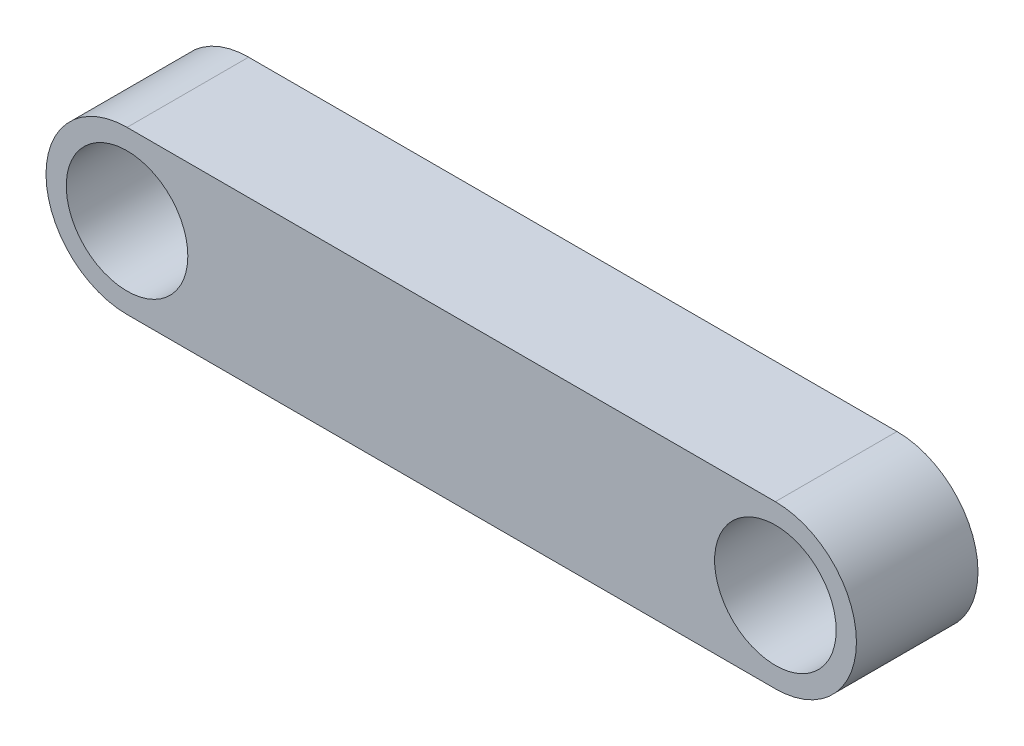
ISO-10303-21;
HEADER;
FILE_DESCRIPTION(('STEP AP214'),'2;1');
FILE_NAME('part.step','',(''),(''),'','','');
FILE_SCHEMA(('AUTOMOTIVE_DESIGN { 1 0 10303 214 1 1 1 1 }'));
ENDSEC;
DATA;
#1=APPLICATION_CONTEXT('core data for automotive mechanical design processes');
#2=APPLICATION_PROTOCOL_DEFINITION('international standard','automotive_design',2000,#1);
#3=PRODUCT_CONTEXT('',#1,'mechanical');
#4=PRODUCT('Part','Part','',(#3));
#5=PRODUCT_RELATED_PRODUCT_CATEGORY('part','',(#4));
#6=PRODUCT_DEFINITION_FORMATION('','',#4);
#7=PRODUCT_DEFINITION_CONTEXT('part definition',#1,'design');
#8=PRODUCT_DEFINITION('design','',#6,#7);
#9=PRODUCT_DEFINITION_SHAPE('','',#8);
#10=(LENGTH_UNIT() NAMED_UNIT(*) SI_UNIT(.MILLI.,.METRE.));
#11=(NAMED_UNIT(*) PLANE_ANGLE_UNIT() SI_UNIT($,.RADIAN.));
#12=(NAMED_UNIT(*) SI_UNIT($,.STERADIAN.) SOLID_ANGLE_UNIT());
#13=UNCERTAINTY_MEASURE_WITH_UNIT(LENGTH_MEASURE(1.E-05),#10,'distance_accuracy_value','');
#14=(GEOMETRIC_REPRESENTATION_CONTEXT(3) GLOBAL_UNCERTAINTY_ASSIGNED_CONTEXT((#13)) GLOBAL_UNIT_ASSIGNED_CONTEXT((#10,
#11,#12)) REPRESENTATION_CONTEXT('',''));
#15=CARTESIAN_POINT('',(0.,0.,0.));
#16=DIRECTION('',(0.,0.,1.));
#17=DIRECTION('',(1.,0.,0.));
#18=AXIS2_PLACEMENT_3D('',#15,#16,#17);
#19=CARTESIAN_POINT('',(8.,0.,3.));
#20=DIRECTION('',(0.,0.,-1.));
#21=DIRECTION('',(-1.,0.,0.));
#22=AXIS2_PLACEMENT_3D('',#19,#20,#21);
#23=CYLINDRICAL_SURFACE('',#22,1.5);
#24=CARTESIAN_POINT('',(8.,0.,3.));
#25=DIRECTION('',(0.,0.,1.));
#26=DIRECTION('',(1.,0.,0.));
#27=AXIS2_PLACEMENT_3D('',#24,#25,#26);
#28=CIRCLE('',#27,1.5);
#29=CARTESIAN_POINT('',(9.5,0.,3.));
#30=VERTEX_POINT('',#29);
#31=EDGE_CURVE('E140',#30,#30,#28,.F.);
#32=ORIENTED_EDGE('',*,*,#31,.F.);
#33=EDGE_LOOP('',(#32));
#34=FACE_BOUND('',#33,.T.);
#35=CARTESIAN_POINT('',(8.,0.,0.));
#36=DIRECTION('',(0.,0.,1.));
#37=DIRECTION('',(1.,0.,0.));
#38=AXIS2_PLACEMENT_3D('',#35,#36,#37);
#39=CIRCLE('',#38,1.5);
#40=CARTESIAN_POINT('',(9.5,0.,0.));
#41=VERTEX_POINT('',#40);
#42=EDGE_CURVE('E152',#41,#41,#39,.F.);
#43=ORIENTED_EDGE('',*,*,#42,.T.);
#44=EDGE_LOOP('',(#43));
#45=FACE_BOUND('',#44,.T.);
#46=ADVANCED_FACE('F77',(#34,#45),#23,.F.);
#47=CARTESIAN_POINT('',(8.,0.,3.));
#48=DIRECTION('',(0.,0.,-1.));
#49=DIRECTION('',(-1.,0.,0.));
#50=AXIS2_PLACEMENT_3D('',#47,#48,#49);
#51=CYLINDRICAL_SURFACE('',#50,2.00000000000001);
#52=CARTESIAN_POINT('',(8.,0.,0.));
#53=DIRECTION('',(0.,0.,1.));
#54=DIRECTION('',(1.,0.,0.));
#55=AXIS2_PLACEMENT_3D('',#52,#53,#54);
#56=CIRCLE('',#55,2.00000000000001);
#57=CARTESIAN_POINT('',(8.,2.,0.));
#58=VERTEX_POINT('',#57);
#59=CARTESIAN_POINT('',(8.,-2.,0.));
#60=VERTEX_POINT('',#59);
#61=EDGE_CURVE('E128',#58,#60,#56,.F.);
#62=ORIENTED_EDGE('',*,*,#61,.F.);
#63=DIRECTION('',(0.,0.,-1.));
#64=VECTOR('',#63,1.);
#65=CARTESIAN_POINT('',(8.,2.,3.));
#66=LINE('',#65,#64);
#67=CARTESIAN_POINT('',(8.,2.,3.));
#68=VERTEX_POINT('',#67);
#69=EDGE_CURVE('E87',#68,#58,#66,.T.);
#70=ORIENTED_EDGE('',*,*,#69,.F.);
#71=CARTESIAN_POINT('',(8.,0.,3.));
#72=DIRECTION('',(0.,0.,1.));
#73=DIRECTION('',(1.,0.,0.));
#74=AXIS2_PLACEMENT_3D('',#71,#72,#73);
#75=CIRCLE('',#74,2.00000000000001);
#76=CARTESIAN_POINT('',(8.,-2.,3.));
#77=VERTEX_POINT('',#76);
#78=EDGE_CURVE('E126',#68,#77,#75,.F.);
#79=ORIENTED_EDGE('',*,*,#78,.T.);
#80=DIRECTION('',(0.,0.,-1.));
#81=VECTOR('',#80,1.);
#82=CARTESIAN_POINT('',(8.,-2.,3.));
#83=LINE('',#82,#81);
#84=EDGE_CURVE('E12',#77,#60,#83,.T.);
#85=ORIENTED_EDGE('',*,*,#84,.T.);
#86=EDGE_LOOP('',(#62,#70,#79,#85));
#87=FACE_BOUND('',#86,.T.);
#88=ADVANCED_FACE('F125',(#87),#51,.T.);
#89=CARTESIAN_POINT('',(0.,2.,3.));
#90=DIRECTION('',(0.,1.,0.));
#91=DIRECTION('',(0.,0.,1.));
#92=AXIS2_PLACEMENT_3D('',#89,#90,#91);
#93=PLANE('',#92);
#94=DIRECTION('',(1.,0.,0.));
#95=VECTOR('',#94,1.);
#96=CARTESIAN_POINT('',(0.,2.,0.));
#97=LINE('',#96,#95);
#98=CARTESIAN_POINT('',(-8.,2.,0.));
#99=VERTEX_POINT('',#98);
#100=EDGE_CURVE('E150',#99,#58,#97,.T.);
#101=ORIENTED_EDGE('',*,*,#100,.F.);
#102=DIRECTION('',(0.,0.,-1.));
#103=VECTOR('',#102,1.);
#104=CARTESIAN_POINT('',(-8.,2.,3.));
#105=LINE('',#104,#103);
#106=CARTESIAN_POINT('',(-8.,2.,3.));
#107=VERTEX_POINT('',#106);
#108=EDGE_CURVE('E109',#107,#99,#105,.T.);
#109=ORIENTED_EDGE('',*,*,#108,.F.);
#110=DIRECTION('',(1.,0.,0.));
#111=VECTOR('',#110,1.);
#112=CARTESIAN_POINT('',(0.,2.,3.));
#113=LINE('',#112,#111);
#114=EDGE_CURVE('E137',#107,#68,#113,.T.);
#115=ORIENTED_EDGE('',*,*,#114,.T.);
#116=ORIENTED_EDGE('',*,*,#69,.T.);
#117=EDGE_LOOP('',(#101,#109,#115,#116));
#118=FACE_BOUND('',#117,.T.);
#119=ADVANCED_FACE('F139',(#118),#93,.T.);
#120=CARTESIAN_POINT('',(0.,-2.,3.));
#121=DIRECTION('',(0.,1.,0.));
#122=DIRECTION('',(0.,0.,1.));
#123=AXIS2_PLACEMENT_3D('',#120,#121,#122);
#124=PLANE('',#123);
#125=DIRECTION('',(1.,0.,0.));
#126=VECTOR('',#125,1.);
#127=CARTESIAN_POINT('',(0.,-2.,0.));
#128=LINE('',#127,#126);
#129=CARTESIAN_POINT('',(-8.,-2.,0.));
#130=VERTEX_POINT('',#129);
#131=EDGE_CURVE('E146',#130,#60,#128,.T.);
#132=ORIENTED_EDGE('',*,*,#131,.T.);
#133=ORIENTED_EDGE('',*,*,#84,.F.);
#134=DIRECTION('',(1.,0.,0.));
#135=VECTOR('',#134,1.);
#136=CARTESIAN_POINT('',(0.,-2.,3.));
#137=LINE('',#136,#135);
#138=CARTESIAN_POINT('',(-8.,-2.,3.));
#139=VERTEX_POINT('',#138);
#140=EDGE_CURVE('E119',#139,#77,#137,.T.);
#141=ORIENTED_EDGE('',*,*,#140,.F.);
#142=DIRECTION('',(0.,0.,-1.));
#143=VECTOR('',#142,1.);
#144=CARTESIAN_POINT('',(-8.,-2.,3.));
#145=LINE('',#144,#143);
#146=EDGE_CURVE('E96',#139,#130,#145,.T.);
#147=ORIENTED_EDGE('',*,*,#146,.T.);
#148=EDGE_LOOP('',(#132,#133,#141,#147));
#149=FACE_BOUND('',#148,.T.);
#150=ADVANCED_FACE('F166',(#149),#124,.F.);
#151=CARTESIAN_POINT('',(0.,0.,0.));
#152=DIRECTION('',(0.,0.,1.));
#153=DIRECTION('',(1.,0.,0.));
#154=AXIS2_PLACEMENT_3D('',#151,#152,#153);
#155=PLANE('',#154);
#156=ORIENTED_EDGE('',*,*,#131,.F.);
#157=CARTESIAN_POINT('',(-8.,0.,0.));
#158=DIRECTION('',(0.,0.,1.));
#159=DIRECTION('',(1.,0.,0.));
#160=AXIS2_PLACEMENT_3D('',#157,#158,#159);
#161=CIRCLE('',#160,2.);
#162=EDGE_CURVE('E81',#99,#130,#161,.T.);
#163=ORIENTED_EDGE('',*,*,#162,.F.);
#164=ORIENTED_EDGE('',*,*,#100,.T.);
#165=ORIENTED_EDGE('',*,*,#61,.T.);
#166=EDGE_LOOP('',(#156,#163,#164,#165));
#167=FACE_BOUND('',#166,.T.);
#168=ORIENTED_EDGE('',*,*,#42,.F.);
#169=EDGE_LOOP('',(#168));
#170=FACE_BOUND('',#169,.T.);
#171=CARTESIAN_POINT('',(-8.,0.,0.));
#172=DIRECTION('',(0.,0.,1.));
#173=DIRECTION('',(1.,0.,0.));
#174=AXIS2_PLACEMENT_3D('',#171,#172,#173);
#175=CIRCLE('',#174,1.5);
#176=CARTESIAN_POINT('',(-6.5,0.,0.));
#177=VERTEX_POINT('',#176);
#178=EDGE_CURVE('E160',#177,#177,#175,.T.);
#179=ORIENTED_EDGE('',*,*,#178,.T.);
#180=EDGE_LOOP('',(#179));
#181=FACE_BOUND('',#180,.T.);
#182=ADVANCED_FACE('F164',(#167,#170,#181),#155,.F.);
#183=CARTESIAN_POINT('',(0.,0.,3.));
#184=DIRECTION('',(0.,0.,1.));
#185=DIRECTION('',(1.,0.,0.));
#186=AXIS2_PLACEMENT_3D('',#183,#184,#185);
#187=PLANE('',#186);
#188=ORIENTED_EDGE('',*,*,#140,.T.);
#189=ORIENTED_EDGE('',*,*,#78,.F.);
#190=ORIENTED_EDGE('',*,*,#114,.F.);
#191=CARTESIAN_POINT('',(-8.,0.,3.));
#192=DIRECTION('',(0.,0.,1.));
#193=DIRECTION('',(1.,0.,0.));
#194=AXIS2_PLACEMENT_3D('',#191,#192,#193);
#195=CIRCLE('',#194,2.);
#196=EDGE_CURVE('E148',#107,#139,#195,.T.);
#197=ORIENTED_EDGE('',*,*,#196,.T.);
#198=EDGE_LOOP('',(#188,#189,#190,#197));
#199=FACE_BOUND('',#198,.T.);
#200=ORIENTED_EDGE('',*,*,#31,.T.);
#201=EDGE_LOOP('',(#200));
#202=FACE_BOUND('',#201,.T.);
#203=CARTESIAN_POINT('',(-8.,0.,3.));
#204=DIRECTION('',(0.,0.,1.));
#205=DIRECTION('',(1.,0.,0.));
#206=AXIS2_PLACEMENT_3D('',#203,#204,#205);
#207=CIRCLE('',#206,1.5);
#208=CARTESIAN_POINT('',(-6.5,0.,3.));
#209=VERTEX_POINT('',#208);
#210=EDGE_CURVE('E157',#209,#209,#207,.T.);
#211=ORIENTED_EDGE('',*,*,#210,.F.);
#212=EDGE_LOOP('',(#211));
#213=FACE_BOUND('',#212,.T.);
#214=ADVANCED_FACE('F135',(#199,#202,#213),#187,.T.);
#215=CARTESIAN_POINT('',(-8.,0.,3.));
#216=DIRECTION('',(0.,0.,-1.));
#217=DIRECTION('',(-1.,0.,0.));
#218=AXIS2_PLACEMENT_3D('',#215,#216,#217);
#219=CYLINDRICAL_SURFACE('',#218,1.5);
#220=ORIENTED_EDGE('',*,*,#210,.T.);
#221=EDGE_LOOP('',(#220));
#222=FACE_BOUND('',#221,.T.);
#223=ORIENTED_EDGE('',*,*,#178,.F.);
#224=EDGE_LOOP('',(#223));
#225=FACE_BOUND('',#224,.T.);
#226=ADVANCED_FACE('F186',(#222,#225),#219,.F.);
#227=CARTESIAN_POINT('',(-8.,0.,3.));
#228=DIRECTION('',(0.,0.,-1.));
#229=DIRECTION('',(-1.,0.,0.));
#230=AXIS2_PLACEMENT_3D('',#227,#228,#229);
#231=CYLINDRICAL_SURFACE('',#230,2.);
#232=ORIENTED_EDGE('',*,*,#162,.T.);
#233=ORIENTED_EDGE('',*,*,#146,.F.);
#234=ORIENTED_EDGE('',*,*,#196,.F.);
#235=ORIENTED_EDGE('',*,*,#108,.T.);
#236=EDGE_LOOP('',(#232,#233,#234,#235));
#237=FACE_BOUND('',#236,.T.);
#238=ADVANCED_FACE('F79',(#237),#231,.T.);
#239=CLOSED_SHELL('',(#46,#88,#119,#150,#182,#214,#226,#238));
#240=MANIFOLD_SOLID_BREP('B2',#239);
#241=ADVANCED_BREP_SHAPE_REPRESENTATION('',(#18,#240),#14);
#242=SHAPE_DEFINITION_REPRESENTATION(#9,#241);
ENDSEC;
END-ISO-10303-21;
